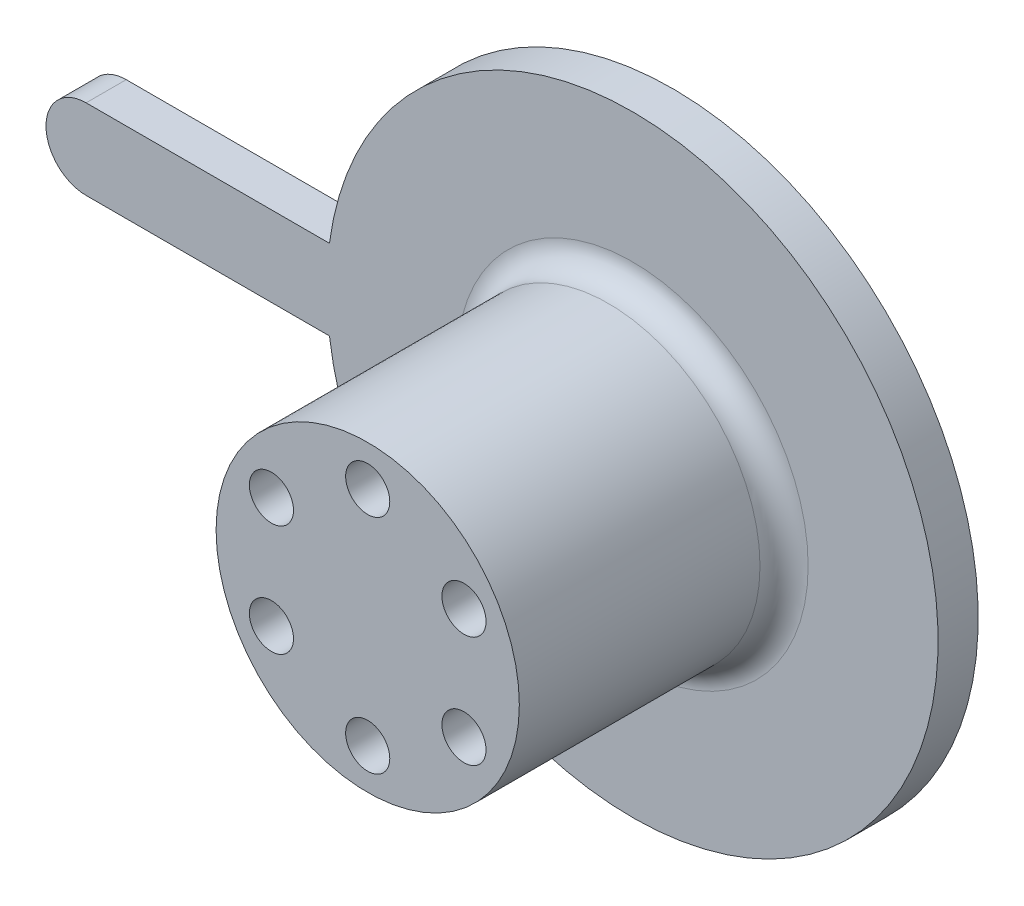
ISO-10303-21;
HEADER;
FILE_DESCRIPTION(('STEP AP214'),'2;1');
FILE_NAME('part.step','',(''),(''),'','','');
FILE_SCHEMA(('AUTOMOTIVE_DESIGN { 1 0 10303 214 1 1 1 1 }'));
ENDSEC;
DATA;
#1=APPLICATION_CONTEXT('core data for automotive mechanical design processes');
#2=APPLICATION_PROTOCOL_DEFINITION('international standard','automotive_design',2000,#1);
#3=PRODUCT_CONTEXT('',#1,'mechanical');
#4=PRODUCT('Part','Part','',(#3));
#5=PRODUCT_RELATED_PRODUCT_CATEGORY('part','',(#4));
#6=PRODUCT_DEFINITION_FORMATION('','',#4);
#7=PRODUCT_DEFINITION_CONTEXT('part definition',#1,'design');
#8=PRODUCT_DEFINITION('design','',#6,#7);
#9=PRODUCT_DEFINITION_SHAPE('','',#8);
#10=(LENGTH_UNIT() NAMED_UNIT(*) SI_UNIT(.MILLI.,.METRE.));
#11=(NAMED_UNIT(*) PLANE_ANGLE_UNIT() SI_UNIT($,.RADIAN.));
#12=(NAMED_UNIT(*) SI_UNIT($,.STERADIAN.) SOLID_ANGLE_UNIT());
#13=UNCERTAINTY_MEASURE_WITH_UNIT(LENGTH_MEASURE(1.E-05),#10,'distance_accuracy_value','');
#14=(GEOMETRIC_REPRESENTATION_CONTEXT(3) GLOBAL_UNCERTAINTY_ASSIGNED_CONTEXT((#13)) GLOBAL_UNIT_ASSIGNED_CONTEXT((#10,
#11,#12)) REPRESENTATION_CONTEXT('',''));
#15=CARTESIAN_POINT('',(0.,0.,0.));
#16=DIRECTION('',(0.,0.,1.));
#17=DIRECTION('',(1.,0.,0.));
#18=AXIS2_PLACEMENT_3D('',#15,#16,#17);
#19=CARTESIAN_POINT('',(-68.1,0.,5.));
#20=DIRECTION('',(0.,0.,-1.));
#21=DIRECTION('',(-1.,0.,0.));
#22=AXIS2_PLACEMENT_3D('',#19,#20,#21);
#23=CYLINDRICAL_SURFACE('',#22,5.);
#24=CARTESIAN_POINT('',(-68.1,0.,0.));
#25=DIRECTION('',(0.,0.,1.));
#26=DIRECTION('',(1.,0.,0.));
#27=AXIS2_PLACEMENT_3D('',#24,#25,#26);
#28=CIRCLE('',#27,5.);
#29=CARTESIAN_POINT('',(-68.1,5.,0.));
#30=VERTEX_POINT('',#29);
#31=CARTESIAN_POINT('',(-68.1,-5.,0.));
#32=VERTEX_POINT('',#31);
#33=EDGE_CURVE('E118',#30,#32,#28,.T.);
#34=ORIENTED_EDGE('',*,*,#33,.T.);
#35=DIRECTION('',(0.,0.,-1.));
#36=VECTOR('',#35,1.);
#37=CARTESIAN_POINT('',(-68.1,-5.,5.));
#38=LINE('',#37,#36);
#39=CARTESIAN_POINT('',(-68.1,-5.,5.));
#40=VERTEX_POINT('',#39);
#41=EDGE_CURVE('E108',#40,#32,#38,.T.);
#42=ORIENTED_EDGE('',*,*,#41,.F.);
#43=CARTESIAN_POINT('',(-68.1,0.,5.));
#44=DIRECTION('',(0.,0.,1.));
#45=DIRECTION('',(1.,0.,0.));
#46=AXIS2_PLACEMENT_3D('',#43,#44,#45);
#47=CIRCLE('',#46,5.);
#48=CARTESIAN_POINT('',(-68.1,5.,5.));
#49=VERTEX_POINT('',#48);
#50=EDGE_CURVE('E97',#49,#40,#47,.T.);
#51=ORIENTED_EDGE('',*,*,#50,.F.);
#52=DIRECTION('',(0.,0.,-1.));
#53=VECTOR('',#52,1.);
#54=CARTESIAN_POINT('',(-68.1,5.,5.));
#55=LINE('',#54,#53);
#56=EDGE_CURVE('E63',#49,#30,#55,.T.);
#57=ORIENTED_EDGE('',*,*,#56,.T.);
#58=EDGE_LOOP('',(#34,#42,#51,#57));
#59=FACE_BOUND('',#58,.T.);
#60=ADVANCED_FACE('F45',(#59),#23,.T.);
#61=CARTESIAN_POINT('',(0.,-5.,5.));
#62=DIRECTION('',(0.,1.,0.));
#63=DIRECTION('',(0.,0.,1.));
#64=AXIS2_PLACEMENT_3D('',#61,#62,#63);
#65=PLANE('',#64);
#66=DIRECTION('',(1.,0.,0.));
#67=VECTOR('',#66,1.);
#68=CARTESIAN_POINT('',(0.,-5.,0.));
#69=LINE('',#68,#67);
#70=CARTESIAN_POINT('',(-37.7704911273338,-5.,0.));
#71=VERTEX_POINT('',#70);
#72=EDGE_CURVE('E104',#32,#71,#69,.T.);
#73=ORIENTED_EDGE('',*,*,#72,.T.);
#74=DIRECTION('',(0.,0.,-1.));
#75=VECTOR('',#74,1.);
#76=CARTESIAN_POINT('',(-37.7704911273338,-5.,5.));
#77=LINE('',#76,#75);
#78=CARTESIAN_POINT('',(-37.7704911273338,-5.,5.));
#79=VERTEX_POINT('',#78);
#80=EDGE_CURVE('E102',#79,#71,#77,.T.);
#81=ORIENTED_EDGE('',*,*,#80,.F.);
#82=DIRECTION('',(1.,0.,0.));
#83=VECTOR('',#82,1.);
#84=CARTESIAN_POINT('',(0.,-5.,5.));
#85=LINE('',#84,#83);
#86=EDGE_CURVE('E90',#40,#79,#85,.T.);
#87=ORIENTED_EDGE('',*,*,#86,.F.);
#88=ORIENTED_EDGE('',*,*,#41,.T.);
#89=EDGE_LOOP('',(#73,#81,#87,#88));
#90=FACE_BOUND('',#89,.T.);
#91=ADVANCED_FACE('F103',(#90),#65,.F.);
#92=CARTESIAN_POINT('',(0.,0.,5.));
#93=DIRECTION('',(0.,0.,-1.));
#94=DIRECTION('',(-1.,0.,0.));
#95=AXIS2_PLACEMENT_3D('',#92,#93,#94);
#96=CYLINDRICAL_SURFACE('',#95,38.1);
#97=CARTESIAN_POINT('',(0.,0.,0.));
#98=DIRECTION('',(0.,0.,1.));
#99=DIRECTION('',(1.,0.,0.));
#100=AXIS2_PLACEMENT_3D('',#97,#98,#99);
#101=CIRCLE('',#100,38.1);
#102=CARTESIAN_POINT('',(-37.7704911273338,5.,0.));
#103=VERTEX_POINT('',#102);
#104=EDGE_CURVE('E124',#71,#103,#101,.T.);
#105=ORIENTED_EDGE('',*,*,#104,.T.);
#106=DIRECTION('',(0.,0.,-1.));
#107=VECTOR('',#106,1.);
#108=CARTESIAN_POINT('',(-37.7704911273338,5.,5.));
#109=LINE('',#108,#107);
#110=CARTESIAN_POINT('',(-37.7704911273338,5.,5.));
#111=VERTEX_POINT('',#110);
#112=EDGE_CURVE('E78',#111,#103,#109,.T.);
#113=ORIENTED_EDGE('',*,*,#112,.F.);
#114=CARTESIAN_POINT('',(0.,0.,5.));
#115=DIRECTION('',(0.,0.,1.));
#116=DIRECTION('',(1.,0.,0.));
#117=AXIS2_PLACEMENT_3D('',#114,#115,#116);
#118=CIRCLE('',#117,38.1);
#119=EDGE_CURVE('E96',#79,#111,#118,.T.);
#120=ORIENTED_EDGE('',*,*,#119,.F.);
#121=ORIENTED_EDGE('',*,*,#80,.T.);
#122=EDGE_LOOP('',(#105,#113,#120,#121));
#123=FACE_BOUND('',#122,.T.);
#124=ADVANCED_FACE('F110',(#123),#96,.T.);
#125=CARTESIAN_POINT('',(0.,5.,5.));
#126=DIRECTION('',(0.,1.,0.));
#127=DIRECTION('',(0.,0.,1.));
#128=AXIS2_PLACEMENT_3D('',#125,#126,#127);
#129=PLANE('',#128);
#130=DIRECTION('',(1.,0.,0.));
#131=VECTOR('',#130,1.);
#132=CARTESIAN_POINT('',(0.,5.,0.));
#133=LINE('',#132,#131);
#134=EDGE_CURVE('E127',#30,#103,#133,.T.);
#135=ORIENTED_EDGE('',*,*,#134,.F.);
#136=ORIENTED_EDGE('',*,*,#56,.F.);
#137=DIRECTION('',(1.,0.,0.));
#138=VECTOR('',#137,1.);
#139=CARTESIAN_POINT('',(0.,5.,5.));
#140=LINE('',#139,#138);
#141=EDGE_CURVE('E112',#49,#111,#140,.T.);
#142=ORIENTED_EDGE('',*,*,#141,.T.);
#143=ORIENTED_EDGE('',*,*,#112,.T.);
#144=EDGE_LOOP('',(#135,#136,#142,#143));
#145=FACE_BOUND('',#144,.T.);
#146=ADVANCED_FACE('F167',(#145),#129,.T.);
#147=CARTESIAN_POINT('',(0.,0.,5.));
#148=DIRECTION('',(0.,0.,1.));
#149=DIRECTION('',(1.,0.,0.));
#150=AXIS2_PLACEMENT_3D('',#147,#148,#149);
#151=PLANE('',#150);
#152=CARTESIAN_POINT('',(0.,0.,5.));
#153=DIRECTION('',(0.,0.,1.));
#154=DIRECTION('',(1.,0.,0.));
#155=AXIS2_PLACEMENT_3D('',#152,#153,#154);
#156=CIRCLE('',#155,21.9);
#157=CARTESIAN_POINT('',(21.9,0.,5.));
#158=VERTEX_POINT('',#157);
#159=EDGE_CURVE('E11',#158,#158,#156,.F.);
#160=ORIENTED_EDGE('',*,*,#159,.T.);
#161=EDGE_LOOP('',(#160));
#162=FACE_BOUND('',#161,.T.);
#163=ORIENTED_EDGE('',*,*,#50,.T.);
#164=ORIENTED_EDGE('',*,*,#86,.T.);
#165=ORIENTED_EDGE('',*,*,#119,.T.);
#166=ORIENTED_EDGE('',*,*,#141,.F.);
#167=EDGE_LOOP('',(#163,#164,#165,#166));
#168=FACE_BOUND('',#167,.T.);
#169=ADVANCED_FACE('F93',(#162,#168),#151,.T.);
#170=CARTESIAN_POINT('',(0.,0.,0.));
#171=DIRECTION('',(0.,0.,1.));
#172=DIRECTION('',(1.,0.,0.));
#173=AXIS2_PLACEMENT_3D('',#170,#171,#172);
#174=PLANE('',#173);
#175=CARTESIAN_POINT('',(0.,13.856406460551,0.));
#176=DIRECTION('',(0.,0.,1.));
#177=DIRECTION('',(1.,0.,0.));
#178=AXIS2_PLACEMENT_3D('',#175,#176,#177);
#179=CIRCLE('',#178,2.75);
#180=CARTESIAN_POINT('',(2.75,13.856406460551,0.));
#181=VERTEX_POINT('',#180);
#182=EDGE_CURVE('E203',#181,#181,#179,.T.);
#183=ORIENTED_EDGE('',*,*,#182,.T.);
#184=EDGE_LOOP('',(#183));
#185=FACE_BOUND('',#184,.T.);
#186=CARTESIAN_POINT('',(12.,6.92820323027551,0.));
#187=DIRECTION('',(0.,0.,1.));
#188=DIRECTION('',(1.,0.,0.));
#189=AXIS2_PLACEMENT_3D('',#186,#187,#188);
#190=CIRCLE('',#189,2.75);
#191=CARTESIAN_POINT('',(14.75,6.92820323027551,0.));
#192=VERTEX_POINT('',#191);
#193=EDGE_CURVE('E205',#192,#192,#190,.T.);
#194=ORIENTED_EDGE('',*,*,#193,.T.);
#195=EDGE_LOOP('',(#194));
#196=FACE_BOUND('',#195,.T.);
#197=CARTESIAN_POINT('',(12.,-6.92820323027551,0.));
#198=DIRECTION('',(0.,0.,1.));
#199=DIRECTION('',(1.,0.,0.));
#200=AXIS2_PLACEMENT_3D('',#197,#198,#199);
#201=CIRCLE('',#200,2.75);
#202=CARTESIAN_POINT('',(14.75,-6.92820323027551,0.));
#203=VERTEX_POINT('',#202);
#204=EDGE_CURVE('E212',#203,#203,#201,.T.);
#205=ORIENTED_EDGE('',*,*,#204,.T.);
#206=EDGE_LOOP('',(#205));
#207=FACE_BOUND('',#206,.T.);
#208=CARTESIAN_POINT('',(-12.,6.92820323027551,0.));
#209=DIRECTION('',(0.,0.,1.));
#210=DIRECTION('',(1.,0.,0.));
#211=AXIS2_PLACEMENT_3D('',#208,#209,#210);
#212=CIRCLE('',#211,2.75);
#213=CARTESIAN_POINT('',(-9.25000000000001,6.92820323027551,0.));
#214=VERTEX_POINT('',#213);
#215=EDGE_CURVE('E219',#214,#214,#212,.T.);
#216=ORIENTED_EDGE('',*,*,#215,.T.);
#217=EDGE_LOOP('',(#216));
#218=FACE_BOUND('',#217,.T.);
#219=CARTESIAN_POINT('',(-12.,-6.92820323027552,0.));
#220=DIRECTION('',(0.,0.,1.));
#221=DIRECTION('',(1.,0.,0.));
#222=AXIS2_PLACEMENT_3D('',#219,#220,#221);
#223=CIRCLE('',#222,2.75);
#224=CARTESIAN_POINT('',(-9.25,-6.92820323027552,0.));
#225=VERTEX_POINT('',#224);
#226=EDGE_CURVE('E223',#225,#225,#223,.T.);
#227=ORIENTED_EDGE('',*,*,#226,.T.);
#228=EDGE_LOOP('',(#227));
#229=FACE_BOUND('',#228,.T.);
#230=CARTESIAN_POINT('',(0.,-13.856406460551,0.));
#231=DIRECTION('',(0.,0.,1.));
#232=DIRECTION('',(1.,0.,0.));
#233=AXIS2_PLACEMENT_3D('',#230,#231,#232);
#234=CIRCLE('',#233,2.75);
#235=CARTESIAN_POINT('',(2.75,-13.856406460551,0.));
#236=VERTEX_POINT('',#235);
#237=EDGE_CURVE('E227',#236,#236,#234,.T.);
#238=ORIENTED_EDGE('',*,*,#237,.T.);
#239=EDGE_LOOP('',(#238));
#240=FACE_BOUND('',#239,.T.);
#241=ORIENTED_EDGE('',*,*,#33,.F.);
#242=ORIENTED_EDGE('',*,*,#134,.T.);
#243=ORIENTED_EDGE('',*,*,#104,.F.);
#244=ORIENTED_EDGE('',*,*,#72,.F.);
#245=EDGE_LOOP('',(#241,#242,#243,#244));
#246=FACE_BOUND('',#245,.T.);
#247=ADVANCED_FACE('F170',(#185,#196,#207,#218,#229,#240,#246),#174,.F.);
#248=CARTESIAN_POINT('',(0.,0.,38.));
#249=DIRECTION('',(0.,0.,-1.));
#250=DIRECTION('',(-1.,0.,0.));
#251=AXIS2_PLACEMENT_3D('',#248,#249,#250);
#252=CYLINDRICAL_SURFACE('',#251,18.9);
#253=CARTESIAN_POINT('',(0.,0.,8.));
#254=DIRECTION('',(0.,0.,1.));
#255=DIRECTION('',(1.,0.,0.));
#256=AXIS2_PLACEMENT_3D('',#253,#254,#255);
#257=CIRCLE('',#256,18.9);
#258=CARTESIAN_POINT('',(18.9,0.,8.));
#259=VERTEX_POINT('',#258);
#260=EDGE_CURVE('E55',#259,#259,#257,.T.);
#261=ORIENTED_EDGE('',*,*,#260,.T.);
#262=EDGE_LOOP('',(#261));
#263=FACE_BOUND('',#262,.T.);
#264=CARTESIAN_POINT('',(0.,0.,38.));
#265=DIRECTION('',(0.,0.,1.));
#266=DIRECTION('',(1.,0.,0.));
#267=AXIS2_PLACEMENT_3D('',#264,#265,#266);
#268=CIRCLE('',#267,18.9);
#269=CARTESIAN_POINT('',(18.9,0.,38.));
#270=VERTEX_POINT('',#269);
#271=EDGE_CURVE('E121',#270,#270,#268,.T.);
#272=ORIENTED_EDGE('',*,*,#271,.F.);
#273=EDGE_LOOP('',(#272));
#274=FACE_BOUND('',#273,.T.);
#275=ADVANCED_FACE('F140',(#263,#274),#252,.T.);
#276=CARTESIAN_POINT('',(0.,0.,38.));
#277=DIRECTION('',(0.,0.,1.));
#278=DIRECTION('',(1.,0.,0.));
#279=AXIS2_PLACEMENT_3D('',#276,#277,#278);
#280=PLANE('',#279);
#281=CARTESIAN_POINT('',(0.,13.856406460551,38.));
#282=DIRECTION('',(0.,0.,1.));
#283=DIRECTION('',(1.,0.,0.));
#284=AXIS2_PLACEMENT_3D('',#281,#282,#283);
#285=CIRCLE('',#284,2.75);
#286=CARTESIAN_POINT('',(2.75,13.856406460551,38.));
#287=VERTEX_POINT('',#286);
#288=EDGE_CURVE('E200',#287,#287,#285,.T.);
#289=ORIENTED_EDGE('',*,*,#288,.F.);
#290=EDGE_LOOP('',(#289));
#291=FACE_BOUND('',#290,.T.);
#292=CARTESIAN_POINT('',(12.,6.92820323027551,38.));
#293=DIRECTION('',(0.,0.,1.));
#294=DIRECTION('',(1.,0.,0.));
#295=AXIS2_PLACEMENT_3D('',#292,#293,#294);
#296=CIRCLE('',#295,2.75);
#297=CARTESIAN_POINT('',(14.75,6.92820323027551,38.));
#298=VERTEX_POINT('',#297);
#299=EDGE_CURVE('E247',#298,#298,#296,.T.);
#300=ORIENTED_EDGE('',*,*,#299,.F.);
#301=EDGE_LOOP('',(#300));
#302=FACE_BOUND('',#301,.T.);
#303=CARTESIAN_POINT('',(12.,-6.92820323027551,38.));
#304=DIRECTION('',(0.,0.,1.));
#305=DIRECTION('',(1.,0.,0.));
#306=AXIS2_PLACEMENT_3D('',#303,#304,#305);
#307=CIRCLE('',#306,2.75);
#308=CARTESIAN_POINT('',(14.75,-6.92820323027551,38.));
#309=VERTEX_POINT('',#308);
#310=EDGE_CURVE('E243',#309,#309,#307,.T.);
#311=ORIENTED_EDGE('',*,*,#310,.F.);
#312=EDGE_LOOP('',(#311));
#313=FACE_BOUND('',#312,.T.);
#314=CARTESIAN_POINT('',(-12.,6.92820323027551,38.));
#315=DIRECTION('',(0.,0.,1.));
#316=DIRECTION('',(1.,0.,0.));
#317=AXIS2_PLACEMENT_3D('',#314,#315,#316);
#318=CIRCLE('',#317,2.75);
#319=CARTESIAN_POINT('',(-9.25000000000001,6.92820323027551,38.));
#320=VERTEX_POINT('',#319);
#321=EDGE_CURVE('E239',#320,#320,#318,.T.);
#322=ORIENTED_EDGE('',*,*,#321,.F.);
#323=EDGE_LOOP('',(#322));
#324=FACE_BOUND('',#323,.T.);
#325=CARTESIAN_POINT('',(-12.,-6.92820323027552,38.));
#326=DIRECTION('',(0.,0.,1.));
#327=DIRECTION('',(1.,0.,0.));
#328=AXIS2_PLACEMENT_3D('',#325,#326,#327);
#329=CIRCLE('',#328,2.75);
#330=CARTESIAN_POINT('',(-9.25,-6.92820323027552,38.));
#331=VERTEX_POINT('',#330);
#332=EDGE_CURVE('E235',#331,#331,#329,.T.);
#333=ORIENTED_EDGE('',*,*,#332,.F.);
#334=EDGE_LOOP('',(#333));
#335=FACE_BOUND('',#334,.T.);
#336=CARTESIAN_POINT('',(0.,-13.856406460551,38.));
#337=DIRECTION('',(0.,0.,1.));
#338=DIRECTION('',(1.,0.,0.));
#339=AXIS2_PLACEMENT_3D('',#336,#337,#338);
#340=CIRCLE('',#339,2.75);
#341=CARTESIAN_POINT('',(2.75,-13.856406460551,38.));
#342=VERTEX_POINT('',#341);
#343=EDGE_CURVE('E231',#342,#342,#340,.T.);
#344=ORIENTED_EDGE('',*,*,#343,.F.);
#345=EDGE_LOOP('',(#344));
#346=FACE_BOUND('',#345,.T.);
#347=ORIENTED_EDGE('',*,*,#271,.T.);
#348=EDGE_LOOP('',(#347));
#349=FACE_BOUND('',#348,.T.);
#350=ADVANCED_FACE('F145',(#291,#302,#313,#324,#335,#346,#349),#280,.T.);
#351=CARTESIAN_POINT('',(0.,0.,8.));
#352=DIRECTION('',(0.,0.,1.));
#353=DIRECTION('',(1.,0.,0.));
#354=AXIS2_PLACEMENT_3D('',#351,#352,#353);
#355=TOROIDAL_SURFACE('',#354,21.9,3.);
#356=ORIENTED_EDGE('',*,*,#159,.F.);
#357=EDGE_LOOP('',(#356));
#358=FACE_BOUND('',#357,.T.);
#359=ORIENTED_EDGE('',*,*,#260,.F.);
#360=EDGE_LOOP('',(#359));
#361=FACE_BOUND('',#360,.T.);
#362=ADVANCED_FACE('F47',(#358,#361),#355,.F.);
#363=CARTESIAN_POINT('',(0.,-13.856406460551,-1.48));
#364=DIRECTION('',(0.,0.,1.));
#365=DIRECTION('',(1.,0.,0.));
#366=AXIS2_PLACEMENT_3D('',#363,#364,#365);
#367=CYLINDRICAL_SURFACE('',#366,2.75);
#368=ORIENTED_EDGE('',*,*,#343,.T.);
#369=EDGE_LOOP('',(#368));
#370=FACE_BOUND('',#369,.T.);
#371=ORIENTED_EDGE('',*,*,#237,.F.);
#372=EDGE_LOOP('',(#371));
#373=FACE_BOUND('',#372,.T.);
#374=ADVANCED_FACE('F144',(#370,#373),#367,.F.);
#375=CARTESIAN_POINT('',(-12.,-6.92820323027552,-1.48));
#376=DIRECTION('',(0.,0.,1.));
#377=DIRECTION('',(1.,0.,0.));
#378=AXIS2_PLACEMENT_3D('',#375,#376,#377);
#379=CYLINDRICAL_SURFACE('',#378,2.75);
#380=ORIENTED_EDGE('',*,*,#332,.T.);
#381=EDGE_LOOP('',(#380));
#382=FACE_BOUND('',#381,.T.);
#383=ORIENTED_EDGE('',*,*,#226,.F.);
#384=EDGE_LOOP('',(#383));
#385=FACE_BOUND('',#384,.T.);
#386=ADVANCED_FACE('F152',(#382,#385),#379,.F.);
#387=CARTESIAN_POINT('',(-12.,6.92820323027551,-1.48));
#388=DIRECTION('',(0.,0.,1.));
#389=DIRECTION('',(1.,0.,0.));
#390=AXIS2_PLACEMENT_3D('',#387,#388,#389);
#391=CYLINDRICAL_SURFACE('',#390,2.75);
#392=ORIENTED_EDGE('',*,*,#321,.T.);
#393=EDGE_LOOP('',(#392));
#394=FACE_BOUND('',#393,.T.);
#395=ORIENTED_EDGE('',*,*,#215,.F.);
#396=EDGE_LOOP('',(#395));
#397=FACE_BOUND('',#396,.T.);
#398=ADVANCED_FACE('F179',(#394,#397),#391,.F.);
#399=CARTESIAN_POINT('',(12.,-6.92820323027551,-1.48));
#400=DIRECTION('',(0.,0.,1.));
#401=DIRECTION('',(1.,0.,0.));
#402=AXIS2_PLACEMENT_3D('',#399,#400,#401);
#403=CYLINDRICAL_SURFACE('',#402,2.75);
#404=ORIENTED_EDGE('',*,*,#310,.T.);
#405=EDGE_LOOP('',(#404));
#406=FACE_BOUND('',#405,.T.);
#407=ORIENTED_EDGE('',*,*,#204,.F.);
#408=EDGE_LOOP('',(#407));
#409=FACE_BOUND('',#408,.T.);
#410=ADVANCED_FACE('F183',(#406,#409),#403,.F.);
#411=CARTESIAN_POINT('',(12.,6.92820323027551,-1.48));
#412=DIRECTION('',(0.,0.,1.));
#413=DIRECTION('',(1.,0.,0.));
#414=AXIS2_PLACEMENT_3D('',#411,#412,#413);
#415=CYLINDRICAL_SURFACE('',#414,2.75);
#416=ORIENTED_EDGE('',*,*,#299,.T.);
#417=EDGE_LOOP('',(#416));
#418=FACE_BOUND('',#417,.T.);
#419=ORIENTED_EDGE('',*,*,#193,.F.);
#420=EDGE_LOOP('',(#419));
#421=FACE_BOUND('',#420,.T.);
#422=ADVANCED_FACE('F187',(#418,#421),#415,.F.);
#423=CARTESIAN_POINT('',(0.,13.856406460551,-1.48));
#424=DIRECTION('',(0.,0.,1.));
#425=DIRECTION('',(1.,0.,0.));
#426=AXIS2_PLACEMENT_3D('',#423,#424,#425);
#427=CYLINDRICAL_SURFACE('',#426,2.75);
#428=ORIENTED_EDGE('',*,*,#288,.T.);
#429=EDGE_LOOP('',(#428));
#430=FACE_BOUND('',#429,.T.);
#431=ORIENTED_EDGE('',*,*,#182,.F.);
#432=EDGE_LOOP('',(#431));
#433=FACE_BOUND('',#432,.T.);
#434=ADVANCED_FACE('F191',(#430,#433),#427,.F.);
#435=CLOSED_SHELL('',(#60,#91,#124,#146,#169,#247,#275,#350,#362,#374,#386,#398,#410,#422,#434));
#436=MANIFOLD_SOLID_BREP('B2',#435);
#437=ADVANCED_BREP_SHAPE_REPRESENTATION('',(#18,#436),#14);
#438=SHAPE_DEFINITION_REPRESENTATION(#9,#437);
ENDSEC;
END-ISO-10303-21;
